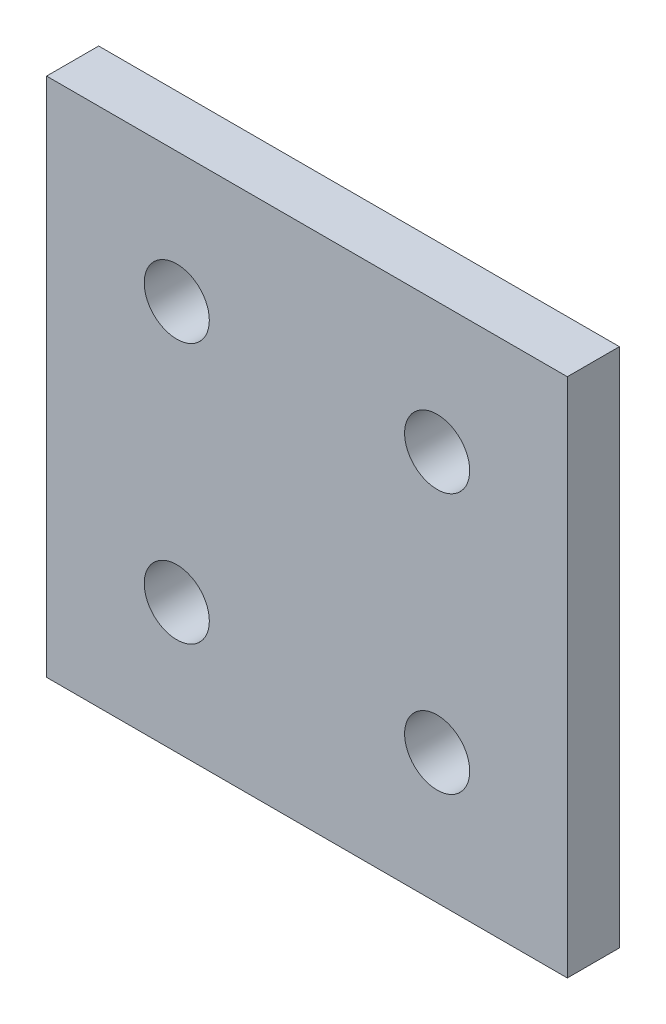
ISO-10303-21;
HEADER;
FILE_DESCRIPTION(('STEP AP214'),'2;1');
FILE_NAME('part.step','',(''),(''),'','','');
FILE_SCHEMA(('AUTOMOTIVE_DESIGN { 1 0 10303 214 1 1 1 1 }'));
ENDSEC;
DATA;
#1=APPLICATION_CONTEXT('core data for automotive mechanical design processes');
#2=APPLICATION_PROTOCOL_DEFINITION('international standard','automotive_design',2000,#1);
#3=PRODUCT_CONTEXT('',#1,'mechanical');
#4=PRODUCT('Part','Part','',(#3));
#5=PRODUCT_RELATED_PRODUCT_CATEGORY('part','',(#4));
#6=PRODUCT_DEFINITION_FORMATION('','',#4);
#7=PRODUCT_DEFINITION_CONTEXT('part definition',#1,'design');
#8=PRODUCT_DEFINITION('design','',#6,#7);
#9=PRODUCT_DEFINITION_SHAPE('','',#8);
#10=(LENGTH_UNIT() NAMED_UNIT(*) SI_UNIT(.MILLI.,.METRE.));
#11=(NAMED_UNIT(*) PLANE_ANGLE_UNIT() SI_UNIT($,.RADIAN.));
#12=(NAMED_UNIT(*) SI_UNIT($,.STERADIAN.) SOLID_ANGLE_UNIT());
#13=UNCERTAINTY_MEASURE_WITH_UNIT(LENGTH_MEASURE(1.E-05),#10,'distance_accuracy_value','');
#14=(GEOMETRIC_REPRESENTATION_CONTEXT(3) GLOBAL_UNCERTAINTY_ASSIGNED_CONTEXT((#13)) GLOBAL_UNIT_ASSIGNED_CONTEXT((#10,
#11,#12)) REPRESENTATION_CONTEXT('',''));
#15=CARTESIAN_POINT('',(0.,0.,0.));
#16=DIRECTION('',(0.,0.,1.));
#17=DIRECTION('',(1.,0.,0.));
#18=AXIS2_PLACEMENT_3D('',#15,#16,#17);
#19=CARTESIAN_POINT('',(0.,0.,4.));
#20=DIRECTION('',(0.,0.,-1.));
#21=DIRECTION('',(-1.,0.,0.));
#22=AXIS2_PLACEMENT_3D('',#19,#20,#21);
#23=PLANE('',#22);
#24=DIRECTION('',(0.,1.,0.));
#25=VECTOR('',#24,1.);
#26=CARTESIAN_POINT('',(20.,-20.,4.));
#27=LINE('',#26,#25);
#28=CARTESIAN_POINT('',(20.,-20.,4.));
#29=VERTEX_POINT('',#28);
#30=CARTESIAN_POINT('',(20.,20.,4.));
#31=VERTEX_POINT('',#30);
#32=EDGE_CURVE('E92',#29,#31,#27,.T.);
#33=ORIENTED_EDGE('',*,*,#32,.T.);
#34=DIRECTION('',(-1.,0.,0.));
#35=VECTOR('',#34,1.);
#36=CARTESIAN_POINT('',(-20.,20.,4.));
#37=LINE('',#36,#35);
#38=CARTESIAN_POINT('',(-20.,20.,4.));
#39=VERTEX_POINT('',#38);
#40=EDGE_CURVE('E87',#31,#39,#37,.T.);
#41=ORIENTED_EDGE('',*,*,#40,.T.);
#42=DIRECTION('',(0.,-1.,0.));
#43=VECTOR('',#42,1.);
#44=CARTESIAN_POINT('',(-20.,-20.,4.));
#45=LINE('',#44,#43);
#46=CARTESIAN_POINT('',(-20.,-20.,4.));
#47=VERTEX_POINT('',#46);
#48=EDGE_CURVE('E90',#39,#47,#45,.T.);
#49=ORIENTED_EDGE('',*,*,#48,.T.);
#50=DIRECTION('',(1.,0.,0.));
#51=VECTOR('',#50,1.);
#52=CARTESIAN_POINT('',(-20.,-20.,4.));
#53=LINE('',#52,#51);
#54=EDGE_CURVE('E57',#47,#29,#53,.T.);
#55=ORIENTED_EDGE('',*,*,#54,.T.);
#56=EDGE_LOOP('',(#33,#41,#49,#55));
#57=FACE_BOUND('',#56,.T.);
#58=CARTESIAN_POINT('',(-10.,10.,4.));
#59=DIRECTION('',(0.,0.,1.));
#60=DIRECTION('',(1.,0.,0.));
#61=AXIS2_PLACEMENT_3D('',#58,#59,#60);
#62=CIRCLE('',#61,2.5);
#63=CARTESIAN_POINT('',(-7.5,10.,4.));
#64=VERTEX_POINT('',#63);
#65=EDGE_CURVE('E112',#64,#64,#62,.T.);
#66=ORIENTED_EDGE('',*,*,#65,.F.);
#67=EDGE_LOOP('',(#66));
#68=FACE_BOUND('',#67,.T.);
#69=CARTESIAN_POINT('',(10.,9.99999999999997,4.));
#70=DIRECTION('',(0.,0.,1.));
#71=DIRECTION('',(1.,0.,0.));
#72=AXIS2_PLACEMENT_3D('',#69,#70,#71);
#73=CIRCLE('',#72,2.5);
#74=CARTESIAN_POINT('',(12.5,9.99999999999997,4.));
#75=VERTEX_POINT('',#74);
#76=EDGE_CURVE('E134',#75,#75,#73,.T.);
#77=ORIENTED_EDGE('',*,*,#76,.F.);
#78=EDGE_LOOP('',(#77));
#79=FACE_BOUND('',#78,.T.);
#80=CARTESIAN_POINT('',(10.0000000000003,-9.99999999999972,4.));
#81=DIRECTION('',(0.,0.,1.));
#82=DIRECTION('',(1.,0.,0.));
#83=AXIS2_PLACEMENT_3D('',#80,#81,#82);
#84=CIRCLE('',#83,2.50000000000044);
#85=CARTESIAN_POINT('',(12.5000000000007,-9.99999999999972,4.));
#86=VERTEX_POINT('',#85);
#87=EDGE_CURVE('E142',#86,#86,#84,.T.);
#88=ORIENTED_EDGE('',*,*,#87,.F.);
#89=EDGE_LOOP('',(#88));
#90=FACE_BOUND('',#89,.T.);
#91=CARTESIAN_POINT('',(-10.0000000000001,-9.9999999999999,4.));
#92=DIRECTION('',(0.,0.,1.));
#93=DIRECTION('',(1.,0.,0.));
#94=AXIS2_PLACEMENT_3D('',#91,#92,#93);
#95=CIRCLE('',#94,2.5);
#96=CARTESIAN_POINT('',(-7.5000000000001,-9.9999999999999,4.));
#97=VERTEX_POINT('',#96);
#98=EDGE_CURVE('E150',#97,#97,#95,.T.);
#99=ORIENTED_EDGE('',*,*,#98,.F.);
#100=EDGE_LOOP('',(#99));
#101=FACE_BOUND('',#100,.T.);
#102=ADVANCED_FACE('F39',(#57,#68,#79,#90,#101),#23,.F.);
#103=CARTESIAN_POINT('',(0.,0.,0.));
#104=DIRECTION('',(0.,0.,-1.));
#105=DIRECTION('',(-1.,0.,0.));
#106=AXIS2_PLACEMENT_3D('',#103,#104,#105);
#107=PLANE('',#106);
#108=CARTESIAN_POINT('',(10.0000000000003,-9.99999999999972,0.));
#109=DIRECTION('',(0.,0.,1.));
#110=DIRECTION('',(1.,0.,0.));
#111=AXIS2_PLACEMENT_3D('',#108,#109,#110);
#112=CIRCLE('',#111,2.50000000000044);
#113=CARTESIAN_POINT('',(12.5000000000007,-9.99999999999972,0.));
#114=VERTEX_POINT('',#113);
#115=EDGE_CURVE('E146',#114,#114,#112,.T.);
#116=ORIENTED_EDGE('',*,*,#115,.T.);
#117=EDGE_LOOP('',(#116));
#118=FACE_BOUND('',#117,.T.);
#119=CARTESIAN_POINT('',(-10.,10.,0.));
#120=DIRECTION('',(0.,0.,1.));
#121=DIRECTION('',(1.,0.,0.));
#122=AXIS2_PLACEMENT_3D('',#119,#120,#121);
#123=CIRCLE('',#122,2.5);
#124=CARTESIAN_POINT('',(-7.5,10.,0.));
#125=VERTEX_POINT('',#124);
#126=EDGE_CURVE('E130',#125,#125,#123,.T.);
#127=ORIENTED_EDGE('',*,*,#126,.T.);
#128=EDGE_LOOP('',(#127));
#129=FACE_BOUND('',#128,.T.);
#130=DIRECTION('',(0.,1.,0.));
#131=VECTOR('',#130,1.);
#132=CARTESIAN_POINT('',(20.,-20.,0.));
#133=LINE('',#132,#131);
#134=CARTESIAN_POINT('',(20.,-20.,0.));
#135=VERTEX_POINT('',#134);
#136=CARTESIAN_POINT('',(20.,20.,0.));
#137=VERTEX_POINT('',#136);
#138=EDGE_CURVE('E108',#135,#137,#133,.T.);
#139=ORIENTED_EDGE('',*,*,#138,.F.);
#140=DIRECTION('',(1.,0.,0.));
#141=VECTOR('',#140,1.);
#142=CARTESIAN_POINT('',(-20.,-20.,0.));
#143=LINE('',#142,#141);
#144=CARTESIAN_POINT('',(-20.,-20.,0.));
#145=VERTEX_POINT('',#144);
#146=EDGE_CURVE('E80',#145,#135,#143,.T.);
#147=ORIENTED_EDGE('',*,*,#146,.F.);
#148=DIRECTION('',(0.,-1.,0.));
#149=VECTOR('',#148,1.);
#150=CARTESIAN_POINT('',(-20.,-20.,0.));
#151=LINE('',#150,#149);
#152=CARTESIAN_POINT('',(-20.,20.,0.));
#153=VERTEX_POINT('',#152);
#154=EDGE_CURVE('E74',#153,#145,#151,.T.);
#155=ORIENTED_EDGE('',*,*,#154,.F.);
#156=DIRECTION('',(-1.,0.,0.));
#157=VECTOR('',#156,1.);
#158=CARTESIAN_POINT('',(-20.,20.,0.));
#159=LINE('',#158,#157);
#160=EDGE_CURVE('E97',#137,#153,#159,.T.);
#161=ORIENTED_EDGE('',*,*,#160,.F.);
#162=EDGE_LOOP('',(#139,#147,#155,#161));
#163=FACE_BOUND('',#162,.T.);
#164=CARTESIAN_POINT('',(10.,9.99999999999997,0.));
#165=DIRECTION('',(0.,0.,1.));
#166=DIRECTION('',(1.,0.,0.));
#167=AXIS2_PLACEMENT_3D('',#164,#165,#166);
#168=CIRCLE('',#167,2.5);
#169=CARTESIAN_POINT('',(12.5,9.99999999999997,0.));
#170=VERTEX_POINT('',#169);
#171=EDGE_CURVE('E138',#170,#170,#168,.T.);
#172=ORIENTED_EDGE('',*,*,#171,.T.);
#173=EDGE_LOOP('',(#172));
#174=FACE_BOUND('',#173,.T.);
#175=CARTESIAN_POINT('',(-10.0000000000001,-9.9999999999999,0.));
#176=DIRECTION('',(0.,0.,1.));
#177=DIRECTION('',(1.,0.,0.));
#178=AXIS2_PLACEMENT_3D('',#175,#176,#177);
#179=CIRCLE('',#178,2.5);
#180=CARTESIAN_POINT('',(-7.5000000000001,-9.9999999999999,0.));
#181=VERTEX_POINT('',#180);
#182=EDGE_CURVE('E154',#181,#181,#179,.T.);
#183=ORIENTED_EDGE('',*,*,#182,.T.);
#184=EDGE_LOOP('',(#183));
#185=FACE_BOUND('',#184,.T.);
#186=ADVANCED_FACE('F125',(#118,#129,#163,#174,#185),#107,.T.);
#187=CARTESIAN_POINT('',(20.,-20.,4.));
#188=DIRECTION('',(-1.,0.,0.));
#189=DIRECTION('',(0.,0.,1.));
#190=AXIS2_PLACEMENT_3D('',#187,#188,#189);
#191=PLANE('',#190);
#192=ORIENTED_EDGE('',*,*,#138,.T.);
#193=DIRECTION('',(0.,0.,-1.));
#194=VECTOR('',#193,1.);
#195=CARTESIAN_POINT('',(20.,20.,4.));
#196=LINE('',#195,#194);
#197=EDGE_CURVE('E11',#31,#137,#196,.T.);
#198=ORIENTED_EDGE('',*,*,#197,.F.);
#199=ORIENTED_EDGE('',*,*,#32,.F.);
#200=DIRECTION('',(0.,0.,-1.));
#201=VECTOR('',#200,1.);
#202=CARTESIAN_POINT('',(20.,-20.,4.));
#203=LINE('',#202,#201);
#204=EDGE_CURVE('E104',#29,#135,#203,.T.);
#205=ORIENTED_EDGE('',*,*,#204,.T.);
#206=EDGE_LOOP('',(#192,#198,#199,#205));
#207=FACE_BOUND('',#206,.T.);
#208=ADVANCED_FACE('F41',(#207),#191,.F.);
#209=CARTESIAN_POINT('',(-20.,20.,4.));
#210=DIRECTION('',(0.,-1.,0.));
#211=DIRECTION('',(0.,0.,-1.));
#212=AXIS2_PLACEMENT_3D('',#209,#210,#211);
#213=PLANE('',#212);
#214=ORIENTED_EDGE('',*,*,#160,.T.);
#215=DIRECTION('',(0.,0.,-1.));
#216=VECTOR('',#215,1.);
#217=CARTESIAN_POINT('',(-20.,20.,4.));
#218=LINE('',#217,#216);
#219=EDGE_CURVE('E49',#39,#153,#218,.T.);
#220=ORIENTED_EDGE('',*,*,#219,.F.);
#221=ORIENTED_EDGE('',*,*,#40,.F.);
#222=ORIENTED_EDGE('',*,*,#197,.T.);
#223=EDGE_LOOP('',(#214,#220,#221,#222));
#224=FACE_BOUND('',#223,.T.);
#225=ADVANCED_FACE('F96',(#224),#213,.F.);
#226=CARTESIAN_POINT('',(-20.,-20.,4.));
#227=DIRECTION('',(1.,0.,0.));
#228=DIRECTION('',(0.,0.,-1.));
#229=AXIS2_PLACEMENT_3D('',#226,#227,#228);
#230=PLANE('',#229);
#231=ORIENTED_EDGE('',*,*,#154,.T.);
#232=DIRECTION('',(0.,0.,-1.));
#233=VECTOR('',#232,1.);
#234=CARTESIAN_POINT('',(-20.,-20.,4.));
#235=LINE('',#234,#233);
#236=EDGE_CURVE('E99',#47,#145,#235,.T.);
#237=ORIENTED_EDGE('',*,*,#236,.F.);
#238=ORIENTED_EDGE('',*,*,#48,.F.);
#239=ORIENTED_EDGE('',*,*,#219,.T.);
#240=EDGE_LOOP('',(#231,#237,#238,#239));
#241=FACE_BOUND('',#240,.T.);
#242=ADVANCED_FACE('F100',(#241),#230,.F.);
#243=CARTESIAN_POINT('',(-20.,-20.,4.));
#244=DIRECTION('',(0.,1.,0.));
#245=DIRECTION('',(0.,0.,1.));
#246=AXIS2_PLACEMENT_3D('',#243,#244,#245);
#247=PLANE('',#246);
#248=ORIENTED_EDGE('',*,*,#146,.T.);
#249=ORIENTED_EDGE('',*,*,#204,.F.);
#250=ORIENTED_EDGE('',*,*,#54,.F.);
#251=ORIENTED_EDGE('',*,*,#236,.T.);
#252=EDGE_LOOP('',(#248,#249,#250,#251));
#253=FACE_BOUND('',#252,.T.);
#254=ADVANCED_FACE('F122',(#253),#247,.F.);
#255=CARTESIAN_POINT('',(-10.,10.,4.));
#256=DIRECTION('',(0.,0.,-1.));
#257=DIRECTION('',(-1.,0.,0.));
#258=AXIS2_PLACEMENT_3D('',#255,#256,#257);
#259=CYLINDRICAL_SURFACE('',#258,2.5);
#260=ORIENTED_EDGE('',*,*,#65,.T.);
#261=EDGE_LOOP('',(#260));
#262=FACE_BOUND('',#261,.T.);
#263=ORIENTED_EDGE('',*,*,#126,.F.);
#264=EDGE_LOOP('',(#263));
#265=FACE_BOUND('',#264,.T.);
#266=ADVANCED_FACE('F173',(#262,#265),#259,.F.);
#267=CARTESIAN_POINT('',(10.,9.99999999999997,4.));
#268=DIRECTION('',(0.,0.,-1.));
#269=DIRECTION('',(-1.,0.,0.));
#270=AXIS2_PLACEMENT_3D('',#267,#268,#269);
#271=CYLINDRICAL_SURFACE('',#270,2.5);
#272=ORIENTED_EDGE('',*,*,#76,.T.);
#273=EDGE_LOOP('',(#272));
#274=FACE_BOUND('',#273,.T.);
#275=ORIENTED_EDGE('',*,*,#171,.F.);
#276=EDGE_LOOP('',(#275));
#277=FACE_BOUND('',#276,.T.);
#278=ADVANCED_FACE('F219',(#274,#277),#271,.F.);
#279=CARTESIAN_POINT('',(10.0000000000003,-9.99999999999972,4.));
#280=DIRECTION('',(0.,0.,-1.));
#281=DIRECTION('',(-1.,0.,0.));
#282=AXIS2_PLACEMENT_3D('',#279,#280,#281);
#283=CYLINDRICAL_SURFACE('',#282,2.50000000000044);
#284=ORIENTED_EDGE('',*,*,#87,.T.);
#285=EDGE_LOOP('',(#284));
#286=FACE_BOUND('',#285,.T.);
#287=ORIENTED_EDGE('',*,*,#115,.F.);
#288=EDGE_LOOP('',(#287));
#289=FACE_BOUND('',#288,.T.);
#290=ADVANCED_FACE('F227',(#286,#289),#283,.F.);
#291=CARTESIAN_POINT('',(-10.0000000000001,-9.9999999999999,4.));
#292=DIRECTION('',(0.,0.,-1.));
#293=DIRECTION('',(-1.,0.,0.));
#294=AXIS2_PLACEMENT_3D('',#291,#292,#293);
#295=CYLINDRICAL_SURFACE('',#294,2.5);
#296=ORIENTED_EDGE('',*,*,#98,.T.);
#297=EDGE_LOOP('',(#296));
#298=FACE_BOUND('',#297,.T.);
#299=ORIENTED_EDGE('',*,*,#182,.F.);
#300=EDGE_LOOP('',(#299));
#301=FACE_BOUND('',#300,.T.);
#302=ADVANCED_FACE('F162',(#298,#301),#295,.F.);
#303=CLOSED_SHELL('',(#102,#186,#208,#225,#242,#254,#266,#278,#290,#302));
#304=MANIFOLD_SOLID_BREP('B2',#303);
#305=ADVANCED_BREP_SHAPE_REPRESENTATION('',(#18,#304),#14);
#306=SHAPE_DEFINITION_REPRESENTATION(#9,#305);
ENDSEC;
END-ISO-10303-21;
